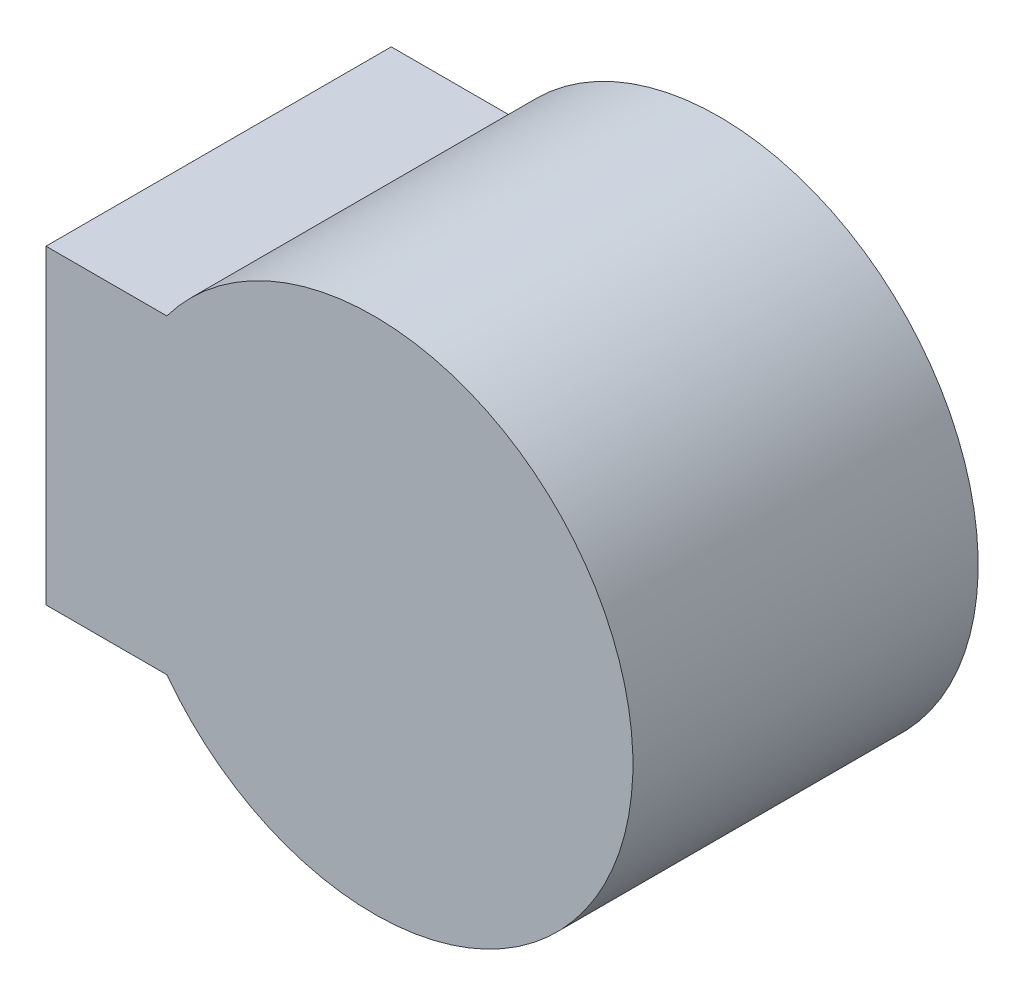
ISO-10303-21;
HEADER;
FILE_DESCRIPTION(('STEP AP214'),'2;1');
FILE_NAME('part.step','',(''),(''),'','','');
FILE_SCHEMA(('AUTOMOTIVE_DESIGN { 1 0 10303 214 1 1 1 1 }'));
ENDSEC;
DATA;
#1=APPLICATION_CONTEXT('core data for automotive mechanical design processes');
#2=APPLICATION_PROTOCOL_DEFINITION('international standard','automotive_design',2000,#1);
#3=PRODUCT_CONTEXT('',#1,'mechanical');
#4=PRODUCT('Part','Part','',(#3));
#5=PRODUCT_RELATED_PRODUCT_CATEGORY('part','',(#4));
#6=PRODUCT_DEFINITION_FORMATION('','',#4);
#7=PRODUCT_DEFINITION_CONTEXT('part definition',#1,'design');
#8=PRODUCT_DEFINITION('design','',#6,#7);
#9=PRODUCT_DEFINITION_SHAPE('','',#8);
#10=(LENGTH_UNIT() NAMED_UNIT(*) SI_UNIT(.MILLI.,.METRE.));
#11=(NAMED_UNIT(*) PLANE_ANGLE_UNIT() SI_UNIT($,.RADIAN.));
#12=(NAMED_UNIT(*) SI_UNIT($,.STERADIAN.) SOLID_ANGLE_UNIT());
#13=UNCERTAINTY_MEASURE_WITH_UNIT(LENGTH_MEASURE(1.E-05),#10,'distance_accuracy_value','');
#14=(GEOMETRIC_REPRESENTATION_CONTEXT(3) GLOBAL_UNCERTAINTY_ASSIGNED_CONTEXT((#13)) GLOBAL_UNIT_ASSIGNED_CONTEXT((#10,
#11,#12)) REPRESENTATION_CONTEXT('',''));
#15=CARTESIAN_POINT('',(0.,0.,0.));
#16=DIRECTION('',(0.,0.,1.));
#17=DIRECTION('',(1.,0.,0.));
#18=AXIS2_PLACEMENT_3D('',#15,#16,#17);
#19=CARTESIAN_POINT('',(-9.5,-4.5,10.));
#20=DIRECTION('',(0.,1.,0.));
#21=DIRECTION('',(-1.,0.,0.));
#22=AXIS2_PLACEMENT_3D('',#19,#20,#21);
#23=PLANE('',#22);
#24=DIRECTION('',(1.,0.,0.));
#25=VECTOR('',#24,1.);
#26=CARTESIAN_POINT('',(-9.5,-4.5,0.));
#27=LINE('',#26,#25);
#28=CARTESIAN_POINT('',(-9.5,-4.5,0.));
#29=VERTEX_POINT('',#28);
#30=CARTESIAN_POINT('',(-6.,-4.5,0.));
#31=VERTEX_POINT('',#30);
#32=EDGE_CURVE('E96',#29,#31,#27,.T.);
#33=ORIENTED_EDGE('',*,*,#32,.T.);
#34=DIRECTION('',(0.,0.,-1.));
#35=VECTOR('',#34,1.);
#36=CARTESIAN_POINT('',(-6.,-4.5,10.));
#37=LINE('',#36,#35);
#38=CARTESIAN_POINT('',(-6.,-4.5,10.));
#39=VERTEX_POINT('',#38);
#40=EDGE_CURVE('E11',#39,#31,#37,.T.);
#41=ORIENTED_EDGE('',*,*,#40,.F.);
#42=DIRECTION('',(1.,0.,0.));
#43=VECTOR('',#42,1.);
#44=CARTESIAN_POINT('',(-9.5,-4.5,10.));
#45=LINE('',#44,#43);
#46=CARTESIAN_POINT('',(-9.5,-4.5,10.));
#47=VERTEX_POINT('',#46);
#48=EDGE_CURVE('E84',#47,#39,#45,.T.);
#49=ORIENTED_EDGE('',*,*,#48,.F.);
#50=DIRECTION('',(0.,0.,-1.));
#51=VECTOR('',#50,1.);
#52=CARTESIAN_POINT('',(-9.5,-4.5,10.));
#53=LINE('',#52,#51);
#54=EDGE_CURVE('E92',#47,#29,#53,.T.);
#55=ORIENTED_EDGE('',*,*,#54,.T.);
#56=EDGE_LOOP('',(#33,#41,#49,#55));
#57=FACE_BOUND('',#56,.T.);
#58=ADVANCED_FACE('F33',(#57),#23,.F.);
#59=CARTESIAN_POINT('',(0.,0.,10.));
#60=DIRECTION('',(0.,0.,-1.));
#61=DIRECTION('',(-1.,0.,0.));
#62=AXIS2_PLACEMENT_3D('',#59,#60,#61);
#63=CYLINDRICAL_SURFACE('',#62,7.5);
#64=CARTESIAN_POINT('',(0.,0.,0.));
#65=DIRECTION('',(0.,0.,1.));
#66=DIRECTION('',(1.,0.,0.));
#67=AXIS2_PLACEMENT_3D('',#64,#65,#66);
#68=CIRCLE('',#67,7.5);
#69=CARTESIAN_POINT('',(-6.,4.5,0.));
#70=VERTEX_POINT('',#69);
#71=EDGE_CURVE('E88',#31,#70,#68,.T.);
#72=ORIENTED_EDGE('',*,*,#71,.T.);
#73=DIRECTION('',(0.,0.,-1.));
#74=VECTOR('',#73,1.);
#75=CARTESIAN_POINT('',(-6.,4.5,10.));
#76=LINE('',#75,#74);
#77=CARTESIAN_POINT('',(-6.,4.5,10.));
#78=VERTEX_POINT('',#77);
#79=EDGE_CURVE('E41',#78,#70,#76,.T.);
#80=ORIENTED_EDGE('',*,*,#79,.F.);
#81=CARTESIAN_POINT('',(0.,0.,10.));
#82=DIRECTION('',(0.,0.,1.));
#83=DIRECTION('',(1.,0.,0.));
#84=AXIS2_PLACEMENT_3D('',#81,#82,#83);
#85=CIRCLE('',#84,7.5);
#86=EDGE_CURVE('E79',#39,#78,#85,.T.);
#87=ORIENTED_EDGE('',*,*,#86,.F.);
#88=ORIENTED_EDGE('',*,*,#40,.T.);
#89=EDGE_LOOP('',(#72,#80,#87,#88));
#90=FACE_BOUND('',#89,.T.);
#91=ADVANCED_FACE('F87',(#90),#63,.T.);
#92=CARTESIAN_POINT('',(-9.5,4.5,10.));
#93=DIRECTION('',(0.,-1.,0.));
#94=DIRECTION('',(0.,0.,-1.));
#95=AXIS2_PLACEMENT_3D('',#92,#93,#94);
#96=PLANE('',#95);
#97=DIRECTION('',(-1.,0.,0.));
#98=VECTOR('',#97,1.);
#99=CARTESIAN_POINT('',(-9.5,4.5,0.));
#100=LINE('',#99,#98);
#101=CARTESIAN_POINT('',(-9.5,4.5,0.));
#102=VERTEX_POINT('',#101);
#103=EDGE_CURVE('E66',#70,#102,#100,.T.);
#104=ORIENTED_EDGE('',*,*,#103,.T.);
#105=DIRECTION('',(0.,0.,-1.));
#106=VECTOR('',#105,1.);
#107=CARTESIAN_POINT('',(-9.5,4.5,10.));
#108=LINE('',#107,#106);
#109=CARTESIAN_POINT('',(-9.5,4.5,10.));
#110=VERTEX_POINT('',#109);
#111=EDGE_CURVE('E89',#110,#102,#108,.T.);
#112=ORIENTED_EDGE('',*,*,#111,.F.);
#113=DIRECTION('',(-1.,0.,0.));
#114=VECTOR('',#113,1.);
#115=CARTESIAN_POINT('',(-9.5,4.5,10.));
#116=LINE('',#115,#114);
#117=EDGE_CURVE('E82',#78,#110,#116,.T.);
#118=ORIENTED_EDGE('',*,*,#117,.F.);
#119=ORIENTED_EDGE('',*,*,#79,.T.);
#120=EDGE_LOOP('',(#104,#112,#118,#119));
#121=FACE_BOUND('',#120,.T.);
#122=ADVANCED_FACE('F90',(#121),#96,.F.);
#123=CARTESIAN_POINT('',(-9.5,-4.5,10.));
#124=DIRECTION('',(1.,0.,0.));
#125=DIRECTION('',(0.,1.,0.));
#126=AXIS2_PLACEMENT_3D('',#123,#124,#125);
#127=PLANE('',#126);
#128=DIRECTION('',(0.,-1.,0.));
#129=VECTOR('',#128,1.);
#130=CARTESIAN_POINT('',(-9.5,-4.5,0.));
#131=LINE('',#130,#129);
#132=EDGE_CURVE('E72',#102,#29,#131,.T.);
#133=ORIENTED_EDGE('',*,*,#132,.T.);
#134=ORIENTED_EDGE('',*,*,#54,.F.);
#135=DIRECTION('',(0.,-1.,0.));
#136=VECTOR('',#135,1.);
#137=CARTESIAN_POINT('',(-9.5,-4.5,10.));
#138=LINE('',#137,#136);
#139=EDGE_CURVE('E49',#110,#47,#138,.T.);
#140=ORIENTED_EDGE('',*,*,#139,.F.);
#141=ORIENTED_EDGE('',*,*,#111,.T.);
#142=EDGE_LOOP('',(#133,#134,#140,#141));
#143=FACE_BOUND('',#142,.T.);
#144=ADVANCED_FACE('F103',(#143),#127,.F.);
#145=CARTESIAN_POINT('',(0.,0.,10.));
#146=DIRECTION('',(0.,0.,1.));
#147=DIRECTION('',(1.,0.,0.));
#148=AXIS2_PLACEMENT_3D('',#145,#146,#147);
#149=PLANE('',#148);
#150=ORIENTED_EDGE('',*,*,#48,.T.);
#151=ORIENTED_EDGE('',*,*,#86,.T.);
#152=ORIENTED_EDGE('',*,*,#117,.T.);
#153=ORIENTED_EDGE('',*,*,#139,.T.);
#154=EDGE_LOOP('',(#150,#151,#152,#153));
#155=FACE_BOUND('',#154,.T.);
#156=ADVANCED_FACE('F80',(#155),#149,.T.);
#157=CARTESIAN_POINT('',(0.,0.,0.));
#158=DIRECTION('',(0.,0.,1.));
#159=DIRECTION('',(1.,0.,0.));
#160=AXIS2_PLACEMENT_3D('',#157,#158,#159);
#161=PLANE('',#160);
#162=ORIENTED_EDGE('',*,*,#32,.F.);
#163=ORIENTED_EDGE('',*,*,#132,.F.);
#164=ORIENTED_EDGE('',*,*,#103,.F.);
#165=ORIENTED_EDGE('',*,*,#71,.F.);
#166=EDGE_LOOP('',(#162,#163,#164,#165));
#167=FACE_BOUND('',#166,.T.);
#168=ADVANCED_FACE('F106',(#167),#161,.F.);
#169=CLOSED_SHELL('',(#58,#91,#122,#144,#156,#168));
#170=MANIFOLD_SOLID_BREP('B2',#169);
#171=ADVANCED_BREP_SHAPE_REPRESENTATION('',(#18,#170),#14);
#172=SHAPE_DEFINITION_REPRESENTATION(#9,#171);
ENDSEC;
END-ISO-10303-21;
